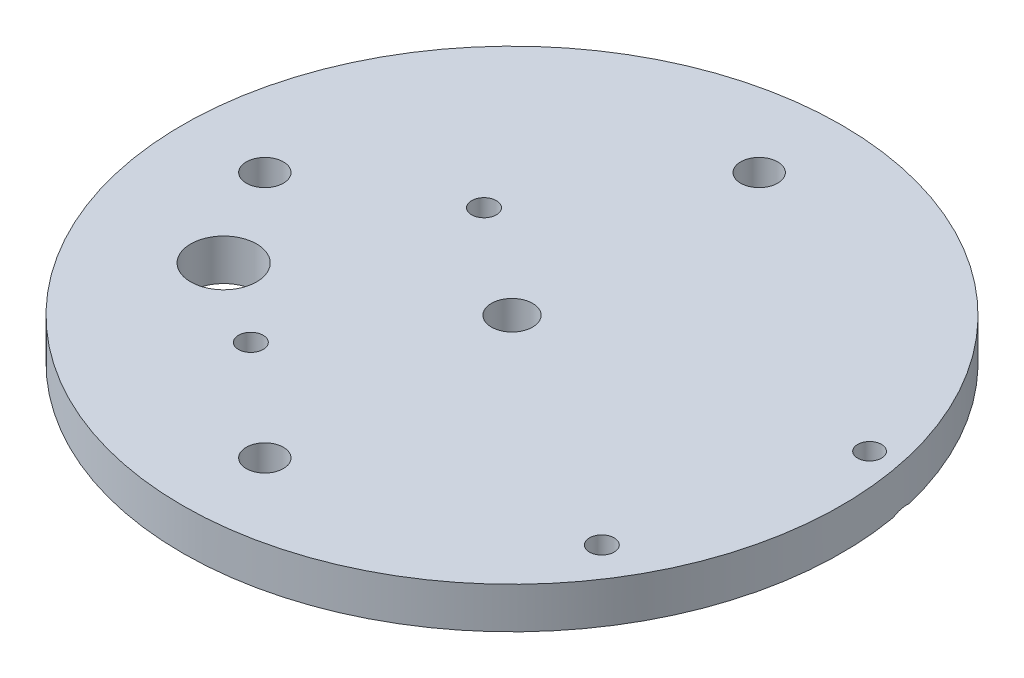
ISO-10303-21;
HEADER;
FILE_DESCRIPTION(('STEP AP214'),'2;1');
FILE_NAME('part.step','',(''),(''),'','','');
FILE_SCHEMA(('AUTOMOTIVE_DESIGN { 1 0 10303 214 1 1 1 1 }'));
ENDSEC;
DATA;
#1=APPLICATION_CONTEXT('core data for automotive mechanical design processes');
#2=APPLICATION_PROTOCOL_DEFINITION('international standard','automotive_design',2000,#1);
#3=PRODUCT_CONTEXT('',#1,'mechanical');
#4=PRODUCT('Part','Part','',(#3));
#5=PRODUCT_RELATED_PRODUCT_CATEGORY('part','',(#4));
#6=PRODUCT_DEFINITION_FORMATION('','',#4);
#7=PRODUCT_DEFINITION_CONTEXT('part definition',#1,'design');
#8=PRODUCT_DEFINITION('design','',#6,#7);
#9=PRODUCT_DEFINITION_SHAPE('','',#8);
#10=(LENGTH_UNIT() NAMED_UNIT(*) SI_UNIT(.MILLI.,.METRE.));
#11=(NAMED_UNIT(*) PLANE_ANGLE_UNIT() SI_UNIT($,.RADIAN.));
#12=(NAMED_UNIT(*) SI_UNIT($,.STERADIAN.) SOLID_ANGLE_UNIT());
#13=UNCERTAINTY_MEASURE_WITH_UNIT(LENGTH_MEASURE(1.E-05),#10,'distance_accuracy_value','');
#14=(GEOMETRIC_REPRESENTATION_CONTEXT(3) GLOBAL_UNCERTAINTY_ASSIGNED_CONTEXT((#13)) GLOBAL_UNIT_ASSIGNED_CONTEXT((#10,
#11,#12)) REPRESENTATION_CONTEXT('',''));
#15=CARTESIAN_POINT('',(0.,0.,0.));
#16=DIRECTION('',(0.,0.,1.));
#17=DIRECTION('',(1.,0.,0.));
#18=AXIS2_PLACEMENT_3D('',#15,#16,#17);
#19=CARTESIAN_POINT('',(0.,0.,0.));
#20=DIRECTION('',(0.,1.,0.));
#21=DIRECTION('',(0.,0.,1.));
#22=AXIS2_PLACEMENT_3D('',#19,#20,#21);
#23=PLANE('',#22);
#24=CARTESIAN_POINT('',(29.6,0.,18.7));
#25=DIRECTION('',(0.,1.,0.));
#26=DIRECTION('',(0.,0.,1.));
#27=AXIS2_PLACEMENT_3D('',#24,#25,#26);
#28=CIRCLE('',#27,3.49999999999999);
#29=CARTESIAN_POINT('',(29.6,0.,22.2));
#30=VERTEX_POINT('',#29);
#31=EDGE_CURVE('E70',#30,#30,#28,.T.);
#32=ORIENTED_EDGE('',*,*,#31,.T.);
#33=EDGE_LOOP('',(#32));
#34=FACE_BOUND('',#33,.T.);
#35=CARTESIAN_POINT('',(-13.,0.,18.7));
#36=DIRECTION('',(0.,1.,0.));
#37=DIRECTION('',(0.,0.,1.));
#38=AXIS2_PLACEMENT_3D('',#35,#36,#37);
#39=CIRCLE('',#38,3.49999999999999);
#40=CARTESIAN_POINT('',(-13.,0.,22.2));
#41=VERTEX_POINT('',#40);
#42=EDGE_CURVE('E157',#41,#41,#39,.T.);
#43=ORIENTED_EDGE('',*,*,#42,.T.);
#44=EDGE_LOOP('',(#43));
#45=FACE_BOUND('',#44,.T.);
#46=CARTESIAN_POINT('',(-13.,0.,-9.6));
#47=DIRECTION('',(0.,1.,0.));
#48=DIRECTION('',(0.,0.,1.));
#49=AXIS2_PLACEMENT_3D('',#46,#47,#48);
#50=CIRCLE('',#49,3.49999999999999);
#51=CARTESIAN_POINT('',(-13.,0.,-6.10000000000001));
#52=VERTEX_POINT('',#51);
#53=EDGE_CURVE('E92',#52,#52,#50,.T.);
#54=ORIENTED_EDGE('',*,*,#53,.T.);
#55=EDGE_LOOP('',(#54));
#56=FACE_BOUND('',#55,.T.);
#57=CARTESIAN_POINT('',(-23.,0.,12.));
#58=DIRECTION('',(0.,1.,0.));
#59=DIRECTION('',(0.,0.,1.));
#60=AXIS2_PLACEMENT_3D('',#57,#58,#59);
#61=CIRCLE('',#60,4.);
#62=CARTESIAN_POINT('',(-23.,0.,16.));
#63=VERTEX_POINT('',#62);
#64=EDGE_CURVE('E242',#63,#63,#61,.T.);
#65=ORIENTED_EDGE('',*,*,#64,.T.);
#66=EDGE_LOOP('',(#65));
#67=FACE_BOUND('',#66,.T.);
#68=CARTESIAN_POINT('',(-30.,0.,0.));
#69=DIRECTION('',(0.,1.,0.));
#70=DIRECTION('',(0.,0.,1.));
#71=AXIS2_PLACEMENT_3D('',#68,#69,#70);
#72=CIRCLE('',#71,2.25);
#73=CARTESIAN_POINT('',(-30.,0.,2.25));
#74=VERTEX_POINT('',#73);
#75=EDGE_CURVE('E185',#74,#74,#72,.T.);
#76=ORIENTED_EDGE('',*,*,#75,.T.);
#77=EDGE_LOOP('',(#76));
#78=FACE_BOUND('',#77,.T.);
#79=CARTESIAN_POINT('',(0.,0.,30.));
#80=DIRECTION('',(0.,1.,0.));
#81=DIRECTION('',(0.,0.,1.));
#82=AXIS2_PLACEMENT_3D('',#79,#80,#81);
#83=CIRCLE('',#82,2.25);
#84=CARTESIAN_POINT('',(0.,0.,32.25));
#85=VERTEX_POINT('',#84);
#86=EDGE_CURVE('E197',#85,#85,#83,.T.);
#87=ORIENTED_EDGE('',*,*,#86,.T.);
#88=EDGE_LOOP('',(#87));
#89=FACE_BOUND('',#88,.T.);
#90=CARTESIAN_POINT('',(0.,0.,-30.));
#91=DIRECTION('',(0.,1.,0.));
#92=DIRECTION('',(0.,0.,1.));
#93=AXIS2_PLACEMENT_3D('',#90,#91,#92);
#94=CIRCLE('',#93,2.25);
#95=CARTESIAN_POINT('',(0.,0.,-27.75));
#96=VERTEX_POINT('',#95);
#97=EDGE_CURVE('E115',#96,#96,#94,.T.);
#98=ORIENTED_EDGE('',*,*,#97,.T.);
#99=EDGE_LOOP('',(#98));
#100=FACE_BOUND('',#99,.T.);
#101=CARTESIAN_POINT('',(0.,0.,0.));
#102=DIRECTION('',(0.,1.,0.));
#103=DIRECTION('',(0.,0.,1.));
#104=AXIS2_PLACEMENT_3D('',#101,#102,#103);
#105=CIRCLE('',#104,40.);
#106=CARTESIAN_POINT('',(38.9170573557783,0.,-9.24460095228898));
#107=VERTEX_POINT('',#106);
#108=CARTESIAN_POINT('',(39.4081344277783,0.,-6.85557735877543));
#109=VERTEX_POINT('',#108);
#110=EDGE_CURVE('E69',#107,#109,#105,.T.);
#111=ORIENTED_EDGE('',*,*,#110,.F.);
#112=CARTESIAN_POINT('',(36.,0.,-7.4));
#113=DIRECTION('',(0.,1.,0.));
#114=DIRECTION('',(0.,0.,1.));
#115=AXIS2_PLACEMENT_3D('',#112,#113,#114);
#116=CIRCLE('',#115,3.45134412802979);
#117=EDGE_CURVE('E64',#107,#109,#116,.T.);
#118=ORIENTED_EDGE('',*,*,#117,.T.);
#119=EDGE_LOOP('',(#111,#118));
#120=FACE_BOUND('',#119,.T.);
#121=CARTESIAN_POINT('',(0.,0.,0.));
#122=DIRECTION('',(0.,1.,0.));
#123=DIRECTION('',(0.,0.,1.));
#124=AXIS2_PLACEMENT_3D('',#121,#122,#123);
#125=CIRCLE('',#124,8.);
#126=CARTESIAN_POINT('',(0.,0.,8.));
#127=VERTEX_POINT('',#126);
#128=EDGE_CURVE('E77',#127,#127,#125,.F.);
#129=ORIENTED_EDGE('',*,*,#128,.F.);
#130=EDGE_LOOP('',(#129));
#131=FACE_BOUND('',#130,.T.);
#132=ADVANCED_FACE('F44',(#34,#45,#56,#67,#78,#89,#100,#120,#131),#23,.F.);
#133=CARTESIAN_POINT('',(0.,5.,0.));
#134=DIRECTION('',(0.,1.,0.));
#135=DIRECTION('',(0.,0.,1.));
#136=AXIS2_PLACEMENT_3D('',#133,#134,#135);
#137=PLANE('',#136);
#138=CARTESIAN_POINT('',(-23.,5.,12.));
#139=DIRECTION('',(0.,1.,0.));
#140=DIRECTION('',(0.,0.,1.));
#141=AXIS2_PLACEMENT_3D('',#138,#139,#140);
#142=CIRCLE('',#141,4.);
#143=CARTESIAN_POINT('',(-23.,5.,16.));
#144=VERTEX_POINT('',#143);
#145=EDGE_CURVE('E239',#144,#144,#142,.T.);
#146=ORIENTED_EDGE('',*,*,#145,.F.);
#147=EDGE_LOOP('',(#146));
#148=FACE_BOUND('',#147,.T.);
#149=CARTESIAN_POINT('',(-13.,5.,18.7));
#150=DIRECTION('',(0.,1.,0.));
#151=DIRECTION('',(0.,0.,1.));
#152=AXIS2_PLACEMENT_3D('',#149,#150,#151);
#153=CIRCLE('',#152,1.5);
#154=CARTESIAN_POINT('',(-13.,5.,20.2));
#155=VERTEX_POINT('',#154);
#156=EDGE_CURVE('E243',#155,#155,#153,.T.);
#157=ORIENTED_EDGE('',*,*,#156,.F.);
#158=EDGE_LOOP('',(#157));
#159=FACE_BOUND('',#158,.T.);
#160=CARTESIAN_POINT('',(29.6,5.,18.7));
#161=DIRECTION('',(0.,1.,0.));
#162=DIRECTION('',(0.,0.,1.));
#163=AXIS2_PLACEMENT_3D('',#160,#161,#162);
#164=CIRCLE('',#163,1.5);
#165=CARTESIAN_POINT('',(29.6,5.,20.2));
#166=VERTEX_POINT('',#165);
#167=EDGE_CURVE('E188',#166,#166,#164,.T.);
#168=ORIENTED_EDGE('',*,*,#167,.F.);
#169=EDGE_LOOP('',(#168));
#170=FACE_BOUND('',#169,.T.);
#171=CARTESIAN_POINT('',(36.,5.,-7.4));
#172=DIRECTION('',(0.,1.,0.));
#173=DIRECTION('',(0.,0.,1.));
#174=AXIS2_PLACEMENT_3D('',#171,#172,#173);
#175=CIRCLE('',#174,1.4513441280298);
#176=CARTESIAN_POINT('',(36.,5.,-5.9486558719702));
#177=VERTEX_POINT('',#176);
#178=EDGE_CURVE('E182',#177,#177,#175,.T.);
#179=ORIENTED_EDGE('',*,*,#178,.F.);
#180=EDGE_LOOP('',(#179));
#181=FACE_BOUND('',#180,.T.);
#182=CARTESIAN_POINT('',(-13.,5.,-9.6));
#183=DIRECTION('',(0.,1.,0.));
#184=DIRECTION('',(0.,0.,1.));
#185=AXIS2_PLACEMENT_3D('',#182,#183,#184);
#186=CIRCLE('',#185,1.5);
#187=CARTESIAN_POINT('',(-13.,5.,-8.1));
#188=VERTEX_POINT('',#187);
#189=EDGE_CURVE('E179',#188,#188,#186,.T.);
#190=ORIENTED_EDGE('',*,*,#189,.F.);
#191=EDGE_LOOP('',(#190));
#192=FACE_BOUND('',#191,.T.);
#193=CARTESIAN_POINT('',(-30.,5.,0.));
#194=DIRECTION('',(0.,1.,0.));
#195=DIRECTION('',(0.,0.,1.));
#196=AXIS2_PLACEMENT_3D('',#193,#194,#195);
#197=CIRCLE('',#196,2.25);
#198=CARTESIAN_POINT('',(-30.,5.,2.25));
#199=VERTEX_POINT('',#198);
#200=EDGE_CURVE('E181',#199,#199,#197,.T.);
#201=ORIENTED_EDGE('',*,*,#200,.F.);
#202=EDGE_LOOP('',(#201));
#203=FACE_BOUND('',#202,.T.);
#204=CARTESIAN_POINT('',(0.,5.,30.));
#205=DIRECTION('',(0.,1.,0.));
#206=DIRECTION('',(0.,0.,1.));
#207=AXIS2_PLACEMENT_3D('',#204,#205,#206);
#208=CIRCLE('',#207,2.25);
#209=CARTESIAN_POINT('',(0.,5.,32.25));
#210=VERTEX_POINT('',#209);
#211=EDGE_CURVE('E194',#210,#210,#208,.T.);
#212=ORIENTED_EDGE('',*,*,#211,.F.);
#213=EDGE_LOOP('',(#212));
#214=FACE_BOUND('',#213,.T.);
#215=CARTESIAN_POINT('',(0.,5.,-30.));
#216=DIRECTION('',(0.,1.,0.));
#217=DIRECTION('',(0.,0.,1.));
#218=AXIS2_PLACEMENT_3D('',#215,#216,#217);
#219=CIRCLE('',#218,2.25);
#220=CARTESIAN_POINT('',(0.,5.,-27.75));
#221=VERTEX_POINT('',#220);
#222=EDGE_CURVE('E199',#221,#221,#219,.T.);
#223=ORIENTED_EDGE('',*,*,#222,.F.);
#224=EDGE_LOOP('',(#223));
#225=FACE_BOUND('',#224,.T.);
#226=CARTESIAN_POINT('',(0.,5.,0.));
#227=DIRECTION('',(0.,1.,0.));
#228=DIRECTION('',(0.,0.,1.));
#229=AXIS2_PLACEMENT_3D('',#226,#227,#228);
#230=CIRCLE('',#229,40.);
#231=CARTESIAN_POINT('',(0.,5.,40.));
#232=VERTEX_POINT('',#231);
#233=EDGE_CURVE('E73',#232,#232,#230,.T.);
#234=ORIENTED_EDGE('',*,*,#233,.T.);
#235=EDGE_LOOP('',(#234));
#236=FACE_BOUND('',#235,.T.);
#237=CARTESIAN_POINT('',(0.,5.,0.));
#238=DIRECTION('',(0.,1.,0.));
#239=DIRECTION('',(0.,0.,1.));
#240=AXIS2_PLACEMENT_3D('',#237,#238,#239);
#241=CIRCLE('',#240,2.5);
#242=CARTESIAN_POINT('',(0.,5.,2.5));
#243=VERTEX_POINT('',#242);
#244=EDGE_CURVE('E74',#243,#243,#241,.T.);
#245=ORIENTED_EDGE('',*,*,#244,.F.);
#246=EDGE_LOOP('',(#245));
#247=FACE_BOUND('',#246,.T.);
#248=ADVANCED_FACE('F123',(#148,#159,#170,#181,#192,#203,#214,#225,#236,#247),#137,.T.);
#249=CARTESIAN_POINT('',(0.,5.,0.));
#250=DIRECTION('',(0.,-1.,0.));
#251=DIRECTION('',(0.,0.,-1.));
#252=AXIS2_PLACEMENT_3D('',#249,#250,#251);
#253=CYLINDRICAL_SURFACE('',#252,40.);
#254=ORIENTED_EDGE('',*,*,#233,.F.);
#255=EDGE_LOOP('',(#254));
#256=FACE_BOUND('',#255,.T.);
#257=ORIENTED_EDGE('',*,*,#110,.T.);
#258=CARTESIAN_POINT('',(39.4081344277783,0.,-6.85557735877543));
#259=CARTESIAN_POINT('',(39.389376291295,0.0355863271321334,-6.9634231640229));
#260=CARTESIAN_POINT('',(39.3699343817354,0.0672935725469322,-7.07254259796736));
#261=CARTESIAN_POINT('',(39.3297002429093,0.121685046320437,-7.2929546006696));
#262=CARTESIAN_POINT('',(39.3089057290956,0.144353522396825,-7.40425061171592));
#263=CARTESIAN_POINT('',(39.2666813407271,0.178754827413858,-7.62495853282954));
#264=CARTESIAN_POINT('',(39.2452883179097,0.190790593423214,-7.73432913791997));
#265=CARTESIAN_POINT('',(39.2014740562354,0.204298750756867,-7.95342000104407));
#266=CARTESIAN_POINT('',(39.1790538386361,0.205781414268566,-8.06313981503189));
#267=CARTESIAN_POINT('',(39.1373837745904,0.198794159584894,-8.26278986852109));
#268=CARTESIAN_POINT('',(39.1182683673851,0.192025837137742,-8.35281262088986));
#269=CARTESIAN_POINT('',(39.0795739445826,0.171567512592041,-8.53201659810573));
#270=CARTESIAN_POINT('',(39.0599946773213,0.157873667148732,-8.62119732764508));
#271=CARTESIAN_POINT('',(39.0199995528053,0.12367673181168,-8.80047039302684));
#272=CARTESIAN_POINT('',(38.9995750379144,0.103011122410356,-8.89052928858857));
#273=CARTESIAN_POINT('',(38.9584826384009,0.0557561737508828,-9.06890397923994));
#274=CARTESIAN_POINT('',(38.937815090017,0.0291742737431636,-9.15722181307193));
#275=CARTESIAN_POINT('',(38.9170573557783,0.,-9.24460095228898));
#276=B_SPLINE_CURVE_WITH_KNOTS('',3,(#258,#259,#260,#261,#262,#263,#264,#265,#266,#267,#268,
#269,#270,#271,#272,#273,#274,#275),.UNSPECIFIED.,.F.,.F.,(4,2,2,2,2,2,2,2,4),(0.,
0.34539998016559,0.691399301219693,1.02718938133422,1.36265256507567,1.63922118707444,
1.9159434605542,2.19962207449496,2.48294598106767),.UNSPECIFIED.);
#277=EDGE_CURVE('E58',#109,#107,#276,.T.);
#278=ORIENTED_EDGE('',*,*,#277,.T.);
#279=EDGE_LOOP('',(#257,#278));
#280=FACE_BOUND('',#279,.T.);
#281=ADVANCED_FACE('F72',(#256,#280),#253,.T.);
#282=CARTESIAN_POINT('',(0.,5.,0.));
#283=DIRECTION('',(0.,-1.,0.));
#284=DIRECTION('',(0.,0.,-1.));
#285=AXIS2_PLACEMENT_3D('',#282,#283,#284);
#286=CYLINDRICAL_SURFACE('',#285,2.5);
#287=CARTESIAN_POINT('',(1.8781639970993,-5.,-1.64999999999999));
#288=CARTESIAN_POINT('',(1.87817356740867,-5.08079427655975,-1.64999443072165));
#289=CARTESIAN_POINT('',(1.88347418282793,-5.16162636905579,-1.64401449371115));
#290=CARTESIAN_POINT('',(1.90365752241833,-5.32041795060532,-1.62058860250622));
#291=CARTESIAN_POINT('',(1.91855745048961,-5.39837201591593,-1.60312206083478));
#292=CARTESIAN_POINT('',(1.95530612756549,-5.54863333158224,-1.55807727538569));
#293=CARTESIAN_POINT('',(1.97708883218857,-5.62098643150526,-1.53059477126483));
#294=CARTESIAN_POINT('',(2.02503214275445,-5.75994524738077,-1.46657517741325));
#295=CARTESIAN_POINT('',(2.05119370638085,-5.82654970122849,-1.43003610611275));
#296=CARTESIAN_POINT('',(2.10971828562919,-5.96321736687682,-1.34248359301899));
#297=CARTESIAN_POINT('',(2.14241946389368,-6.03226727651007,-1.29011420470094));
#298=CARTESIAN_POINT('',(2.20758221587982,-6.16147714614391,-1.17514144468481));
#299=CARTESIAN_POINT('',(2.24004353252863,-6.22162860029669,-1.11252840012498));
#300=CARTESIAN_POINT('',(2.3064419767716,-6.33973271619889,-0.968234915676887));
#301=CARTESIAN_POINT('',(2.33994640603817,-6.39619090363768,-0.885111648041911));
#302=CARTESIAN_POINT('',(2.39949293751456,-6.49384115428655,-0.707908997031467));
#303=CARTESIAN_POINT('',(2.42554320107045,-6.53504992824281,-0.613841755901933));
#304=CARTESIAN_POINT('',(2.46464353514927,-6.59607361226671,-0.428365536633279));
#305=CARTESIAN_POINT('',(2.47881191391302,-6.61774914948943,-0.337811072451684));
#306=CARTESIAN_POINT('',(2.49700266516609,-6.64549014711654,-0.153380704926458));
#307=CARTESIAN_POINT('',(2.50103745363967,-6.65157471024374,-0.059509009173567));
#308=CARTESIAN_POINT('',(2.49868729659539,-6.64800862462095,0.113712663637904));
#309=CARTESIAN_POINT('',(2.49376656842582,-6.64056933208684,0.193140500290941));
#310=CARTESIAN_POINT('',(2.47671798966374,-6.61453692457821,0.349338308191109));
#311=CARTESIAN_POINT('',(2.46458960851095,-6.5959429885018,0.426108083336222));
#312=CARTESIAN_POINT('',(2.4341916732427,-6.54858528412733,0.574862419576155));
#313=CARTESIAN_POINT('',(2.41593946394568,-6.51985022722838,0.646859815580455));
#314=CARTESIAN_POINT('',(2.37464804586783,-6.45331789592822,0.785017034503288));
#315=CARTESIAN_POINT('',(2.35160793342517,-6.41551891060689,0.851175752075159));
#316=CARTESIAN_POINT('',(2.29902245001356,-6.32644819163509,0.985047000791311));
#317=CARTESIAN_POINT('',(2.26902056419845,-6.27406230137877,1.05183695764556));
#318=CARTESIAN_POINT('',(2.20709218917539,-6.16019022775838,1.17625968695308));
#319=CARTESIAN_POINT('',(2.17516278943164,-6.09869006733422,1.23387810796581));
#320=CARTESIAN_POINT('',(2.10711048312635,-5.95750690257424,1.34724934289721));
#321=CARTESIAN_POINT('',(2.07108428413495,-5.87648069757491,1.40139996434747));
#322=CARTESIAN_POINT('',(2.00437957659369,-5.70447022283533,1.49525229324493));
#323=CARTESIAN_POINT('',(1.973691925336,-5.61350342114149,1.53497883258691));
#324=CARTESIAN_POINT('',(1.93021206234819,-5.45004901179961,1.58906609884217));
#325=CARTESIAN_POINT('',(1.91481376393407,-5.37958306194072,1.60742065844977));
#326=CARTESIAN_POINT('',(1.89156962487726,-5.23568483824098,1.63471528383588));
#327=CARTESIAN_POINT('',(1.88371114115,-5.16225774603093,1.64367111218457));
#328=CARTESIAN_POINT('',(1.8767563549997,-5.01413898103529,1.65161100823904));
#329=CARTESIAN_POINT('',(1.87769482426888,-4.93944345582033,1.65055550398266));
#330=CARTESIAN_POINT('',(1.88825914723377,-4.79146670785288,1.6384550878589));
#331=CARTESIAN_POINT('',(1.89789215655036,-4.71818670082213,1.62740194790476));
#332=CARTESIAN_POINT('',(1.92377320788271,-4.57815606994752,1.59670654181037));
#333=CARTESIAN_POINT('',(1.9397182942886,-4.5112601566981,1.57745493961547));
#334=CARTESIAN_POINT('',(1.97637475195715,-4.38158821030647,1.53127715983157));
#335=CARTESIAN_POINT('',(1.99708770330354,-4.31881355184297,1.50434843731629));
#336=CARTESIAN_POINT('',(2.04592024038531,-4.18584653371123,1.43744371796295));
#337=CARTESIAN_POINT('',(2.0746933834994,-4.11666627761783,1.3959374151933));
#338=CARTESIAN_POINT('',(2.13386307226145,-3.9854540035836,1.30370192953132));
#339=CARTESIAN_POINT('',(2.16426156090022,-3.92343083426984,1.2529615255776));
#340=CARTESIAN_POINT('',(2.23066104299162,-3.79502279309446,1.13132559349666));
#341=CARTESIAN_POINT('',(2.26650752858329,-3.73042825569478,1.0584336843705));
#342=CARTESIAN_POINT('',(2.33354741548986,-3.61429294484175,0.901029136145233));
#343=CARTESIAN_POINT('',(2.36474520160667,-3.56273983785047,0.816527594120797));
#344=CARTESIAN_POINT('',(2.41383928477658,-3.48346296196824,0.655022436944608));
#345=CARTESIAN_POINT('',(2.43314294605933,-3.45305320616478,0.579766982761488));
#346=CARTESIAN_POINT('',(2.46500344203446,-3.40340770004291,0.42430571779809));
#347=CARTESIAN_POINT('',(2.47756592552063,-3.38416259316718,0.344104114697708));
#348=CARTESIAN_POINT('',(2.49483359194805,-3.35780779187866,0.180532057501467));
#349=CARTESIAN_POINT('',(2.49950622522129,-3.35074836698326,0.0971499203467993));
#350=CARTESIAN_POINT('',(2.50041880991432,-3.34936521725825,-0.0697703046886462));
#351=CARTESIAN_POINT('',(2.49665914509096,-3.35504091284884,-0.153308385299503));
#352=CARTESIAN_POINT('',(2.48162224491363,-3.37795948175331,-0.312248842068666));
#353=CARTESIAN_POINT('',(2.47086791156197,-3.39439826797345,-0.387820405838236));
#354=CARTESIAN_POINT('',(2.44325497490618,-3.43722616352497,-0.534890956581199));
#355=CARTESIAN_POINT('',(2.4263954123254,-3.46361683656132,-0.606389301510788));
#356=CARTESIAN_POINT('',(2.38659098522815,-3.52725696718865,-0.748299731069997));
#357=CARTESIAN_POINT('',(2.36333062488106,-3.56508395318079,-0.818362050887256));
#358=CARTESIAN_POINT('',(2.31298664760704,-3.64960758414194,-0.951399734920279));
#359=CARTESIAN_POINT('',(2.2859005630314,-3.69630996063965,-1.01437047747239));
#360=CARTESIAN_POINT('',(2.2252813274897,-3.80552907515259,-1.14186276834818));
#361=CARTESIAN_POINT('',(2.19140310364951,-3.86937720174746,-1.20508031729177));
#362=CARTESIAN_POINT('',(2.12387294022856,-4.00656834044153,-1.32046767601712));
#363=CARTESIAN_POINT('',(2.09022116132146,-4.07991747200145,-1.37263030790415));
#364=CARTESIAN_POINT('',(2.02963185186414,-4.22797320198263,-1.46053735742482));
#365=CARTESIAN_POINT('',(2.00236030827309,-4.30189495776458,-1.49736813204505));
#366=CARTESIAN_POINT('',(1.95397052678842,-4.4561091328833,-1.55999123252304));
#367=CARTESIAN_POINT('',(1.93283919103844,-4.53638751989309,-1.58580711054236));
#368=CARTESIAN_POINT('',(1.90415675714692,-4.6806913968137,-1.62004735146956));
#369=CARTESIAN_POINT('',(1.89451740482452,-4.74364690760695,-1.63122690692697));
#370=CARTESIAN_POINT('',(1.88151889606353,-4.87106080182247,-1.64620346660994));
#371=CARTESIAN_POINT('',(1.87815635906731,-4.93551835732424,-1.65000444482245));
#372=CARTESIAN_POINT('',(1.8781639970993,-5.,-1.64999999999999));
#373=B_SPLINE_CURVE_WITH_KNOTS('',3,(#287,#288,#289,#290,#291,#292,#293,#294,#295,#296,#297,
#298,#299,#300,#301,#302,#303,#304,#305,#306,#307,#308,#309,#310,#311,#312,#313,#314,#315,#316,
#317,#318,#319,#320,#321,#322,#323,#324,#325,#326,#327,#328,#329,#330,#331,#332,#333,#334,#335,
#336,#337,#338,#339,#340,#341,#342,#343,#344,#345,#346,#347,#348,#349,#350,#351,#352,#353,#354,
#355,#356,#357,#358,#359,#360,#361,#362,#363,#364,#365,#366,#367,#368,#369,#370,#371,#372),
.UNSPECIFIED.,.T.,.F.,(4,2,2,2,2,2,2,2,2,2,2,2,2,2,2,2,2,2,2,2,2,2,2,2,2,2,2,2,2,2,2,2,2,2,2,2,
2,2,2,2,2,2,4),(0.,0.242089089232209,0.484613262365224,0.724877542229116,0.965194438206264,
1.24204242334406,1.5191533550871,1.83517136959404,2.1508420497088,2.43163690958525,
2.71208756281941,2.95071293244789,3.18935586962916,3.42732851395788,3.66534611375402,
3.93440451568682,4.20387988176698,4.51414003592553,4.82386349786488,5.04625677123857,
5.26827647088752,5.4911741161079,5.714255373899,5.92772322794782,6.14126192794923,
6.3973226153228,6.65369656488881,6.96356575078108,7.27314078239634,7.52238413686407,
7.77141830954319,8.02147738775783,8.2715250859267,8.50474641601314,8.73800440662632,
8.98590102363142,9.23395827408606,9.52089661145359,9.80802068929718,10.067982581361,
10.327385800336,10.5207004402689,10.713910935025),.UNSPECIFIED.);
#374=CARTESIAN_POINT('',(1.8781639970993,-5.,-1.64999999999999));
#375=VERTEX_POINT('',#374);
#376=EDGE_CURVE('E108',#375,#375,#373,.T.);
#377=ORIENTED_EDGE('',*,*,#376,.F.);
#378=EDGE_LOOP('',(#377));
#379=FACE_BOUND('',#378,.T.);
#380=ORIENTED_EDGE('',*,*,#244,.T.);
#381=EDGE_LOOP('',(#380));
#382=FACE_BOUND('',#381,.T.);
#383=CARTESIAN_POINT('',(0.,-10.,0.));
#384=DIRECTION('',(0.,-1.,0.));
#385=DIRECTION('',(0.,0.,-1.));
#386=AXIS2_PLACEMENT_3D('',#383,#384,#385);
#387=CIRCLE('',#386,2.5);
#388=CARTESIAN_POINT('',(0.,-10.,-2.5));
#389=VERTEX_POINT('',#388);
#390=EDGE_CURVE('E114',#389,#389,#387,.T.);
#391=ORIENTED_EDGE('',*,*,#390,.T.);
#392=EDGE_LOOP('',(#391));
#393=FACE_BOUND('',#392,.T.);
#394=ADVANCED_FACE('F118',(#379,#382,#393),#286,.F.);
#395=CARTESIAN_POINT('',(0.,-10.,0.));
#396=DIRECTION('',(0.,-1.,0.));
#397=DIRECTION('',(0.,0.,-1.));
#398=AXIS2_PLACEMENT_3D('',#395,#396,#397);
#399=PLANE('',#398);
#400=CARTESIAN_POINT('',(0.,-10.,0.));
#401=DIRECTION('',(0.,-1.,0.));
#402=DIRECTION('',(0.,0.,-1.));
#403=AXIS2_PLACEMENT_3D('',#400,#401,#402);
#404=CIRCLE('',#403,8.);
#405=CARTESIAN_POINT('',(0.,-10.,-8.));
#406=VERTEX_POINT('',#405);
#407=EDGE_CURVE('E80',#406,#406,#404,.T.);
#408=ORIENTED_EDGE('',*,*,#407,.T.);
#409=EDGE_LOOP('',(#408));
#410=FACE_BOUND('',#409,.T.);
#411=ORIENTED_EDGE('',*,*,#390,.F.);
#412=EDGE_LOOP('',(#411));
#413=FACE_BOUND('',#412,.T.);
#414=ADVANCED_FACE('F105',(#410,#413),#399,.T.);
#415=CARTESIAN_POINT('',(0.,-10.,0.));
#416=DIRECTION('',(0.,1.,0.));
#417=DIRECTION('',(0.,0.,1.));
#418=AXIS2_PLACEMENT_3D('',#415,#416,#417);
#419=CYLINDRICAL_SURFACE('',#418,8.);
#420=CARTESIAN_POINT('',(7.82799463464303,-5.,-1.64999999999999));
#421=CARTESIAN_POINT('',(7.82799647234762,-5.09161734979413,-1.64999668532492));
#422=CARTESIAN_POINT('',(7.82962054015776,-5.18327581475285,-1.64234339972763));
#423=CARTESIAN_POINT('',(7.83593102109728,-5.36399536908582,-1.61196056082935));
#424=CARTESIAN_POINT('',(7.84061980768031,-5.45305438944651,-1.58921932254547));
#425=CARTESIAN_POINT('',(7.85250661788931,-5.62593449220463,-1.52939944297713));
#426=CARTESIAN_POINT('',(7.85970206178508,-5.70976085561277,-1.49233553761891));
#427=CARTESIAN_POINT('',(7.8757883628587,-5.87000460226487,-1.40496339378156));
#428=CARTESIAN_POINT('',(7.88467914491256,-5.94642231357555,-1.35465574212316));
#429=CARTESIAN_POINT('',(7.90330366333985,-6.09083130314561,-1.24141806188275));
#430=CARTESIAN_POINT('',(7.91304715328143,-6.15869500128047,-1.17832691131058));
#431=CARTESIAN_POINT('',(7.93219354684102,-6.28295461376031,-1.04166118718968));
#432=CARTESIAN_POINT('',(7.9415964257225,-6.33934969657567,-0.968085854144698));
#433=CARTESIAN_POINT('',(7.95910768239297,-6.43956942635826,-0.811692001393452));
#434=CARTESIAN_POINT('',(7.9672032148807,-6.48327235381807,-0.728793920101061));
#435=CARTESIAN_POINT('',(7.98107786735649,-6.55608110943422,-0.556636173632876));
#436=CARTESIAN_POINT('',(7.9868572180665,-6.58518839158007,-0.467377143134514));
#437=CARTESIAN_POINT('',(7.99537941797959,-6.62758111250496,-0.286356118265318));
#438=CARTESIAN_POINT('',(7.99816360714569,-6.64108215209674,-0.194646593521387));
#439=CARTESIAN_POINT('',(8.00052470522147,-6.65255227142172,-0.0102247919218247));
#440=CARTESIAN_POINT('',(8.00010194196704,-6.65052293877214,0.0824873814688693));
#441=CARTESIAN_POINT('',(7.9961286601365,-6.63115248809589,0.264799667160885));
#442=CARTESIAN_POINT('',(7.99262559257093,-6.61404365512092,0.354425644609061));
#443=CARTESIAN_POINT('',(7.98293899531616,-6.56536885357579,0.529506535845924));
#444=CARTESIAN_POINT('',(7.97675535366161,-6.53380228111471,0.61496127523955));
#445=CARTESIAN_POINT('',(7.96232481023259,-6.45689604030913,0.779930808135332));
#446=CARTESIAN_POINT('',(7.95406448397429,-6.41146633010899,0.859402403191198));
#447=CARTESIAN_POINT('',(7.93638961806161,-6.30819018594216,1.00967984091354));
#448=CARTESIAN_POINT('',(7.92697493766869,-6.25034223730045,1.08048462481769));
#449=CARTESIAN_POINT('',(7.9078239642189,-6.12260050730486,1.21279807501824));
#450=CARTESIAN_POINT('',(7.89808494418976,-6.05250342398988,1.27411022634264));
#451=CARTESIAN_POINT('',(7.87954771497238,-5.90292295474092,1.38414252261933));
#452=CARTESIAN_POINT('',(7.87074952591437,-5.82343936804768,1.43286239817597));
#453=CARTESIAN_POINT('',(7.85508413098618,-5.65704845467704,1.51640121308693));
#454=CARTESIAN_POINT('',(7.84822159457677,-5.57012382444694,1.55118662114807));
#455=CARTESIAN_POINT('',(7.83727167258975,-5.39148889177412,1.60559987539903));
#456=CARTESIAN_POINT('',(7.83318390018328,-5.29977925832742,1.62522983445702));
#457=CARTESIAN_POINT('',(7.82832430034405,-5.11596343547278,1.64847767759946));
#458=CARTESIAN_POINT('',(7.82749355348184,-5.02389475085064,1.65238010858405));
#459=CARTESIAN_POINT('',(7.82908365669821,-4.840422126306,1.64482933127385));
#460=CARTESIAN_POINT('',(7.83150430988348,-4.74901814646834,1.63337705280604));
#461=CARTESIAN_POINT('',(7.83926913983493,-4.57043707429369,1.59568777426685));
#462=CARTESIAN_POINT('',(7.84458293687797,-4.48322613369048,1.56960432546508));
#463=CARTESIAN_POINT('',(7.85750843647708,-4.31441223673719,1.50355797289372));
#464=CARTESIAN_POINT('',(7.86512033846231,-4.23280976784409,1.46359386451765));
#465=CARTESIAN_POINT('',(7.88191579950281,-4.07628854815773,1.37028211396985));
#466=CARTESIAN_POINT('',(7.89111960565472,-4.00147762450433,1.31675731908658));
#467=CARTESIAN_POINT('',(7.91000699478186,-3.86179547619869,1.19807829347332));
#468=CARTESIAN_POINT('',(7.91969063034348,-3.79692534419906,1.1329227860428));
#469=CARTESIAN_POINT('',(7.93863877717957,-3.67787906230575,0.991551131023625));
#470=CARTESIAN_POINT('',(7.94789380519354,-3.62389583014193,0.915171051258584));
#471=CARTESIAN_POINT('',(7.96477402593325,-3.52952771722255,0.754260738130263));
#472=CARTESIAN_POINT('',(7.97239928979603,-3.48914224289872,0.669730860728576));
#473=CARTESIAN_POINT('',(7.98512048804082,-3.42339319408157,0.495414150876531));
#474=CARTESIAN_POINT('',(7.99023131933467,-3.39794096923201,0.405661891513267));
#475=CARTESIAN_POINT('',(7.99741186635557,-3.36250124752192,0.223039444294583));
#476=CARTESIAN_POINT('',(7.99948197278732,-3.35251176383492,0.130169658580919));
#477=CARTESIAN_POINT('',(8.00033781964049,-3.34836207224363,-0.0542126492055755));
#478=CARTESIAN_POINT('',(7.99918360281958,-3.35391248751723,-0.145718502140299));
#479=CARTESIAN_POINT('',(7.99384751004402,-3.38004339509045,-0.326463478938167));
#480=CARTESIAN_POINT('',(7.98966567723011,-3.40062367322843,-0.415702635080896));
#481=CARTESIAN_POINT('',(7.97874682116246,-3.4560981411582,-0.589186560182794));
#482=CARTESIAN_POINT('',(7.97201637401338,-3.49095551098701,-0.673443542985804));
#483=CARTESIAN_POINT('',(7.95672300876336,-3.57395704210639,-0.834953513276948));
#484=CARTESIAN_POINT('',(7.9481599348062,-3.62210233357253,-0.912205904261775));
#485=CARTESIAN_POINT('',(7.92995681960445,-3.73127864528562,-1.05893847166513));
#486=CARTESIAN_POINT('',(7.92030089151862,-3.79251556975004,-1.12826349060998));
#487=CARTESIAN_POINT('',(7.90109178015231,-3.92571624164647,-1.25575285452552));
#488=CARTESIAN_POINT('',(7.89153862187157,-3.99768253854538,-1.31391453937943));
#489=CARTESIAN_POINT('',(7.8734942340194,-4.15130110382791,-1.41807001635073));
#490=CARTESIAN_POINT('',(7.86501660134749,-4.23305600230841,-1.46391490783103));
#491=CARTESIAN_POINT('',(7.85025069483304,-4.40326288616914,-1.54114313624575));
#492=CARTESIAN_POINT('',(7.84396047891661,-4.4917088455668,-1.57253930936729));
#493=CARTESIAN_POINT('',(7.83550744278865,-4.65026722430231,-1.61404620798977));
#494=CARTESIAN_POINT('',(7.83270799535493,-4.71948894840104,-1.62750420424827));
#495=CARTESIAN_POINT('',(7.82895092043294,-4.85913237654465,-1.64548220150438));
#496=CARTESIAN_POINT('',(7.82799322160417,-4.92955403400329,-1.65000254870378));
#497=CARTESIAN_POINT('',(7.82799463464303,-5.,-1.64999999999999));
#498=B_SPLINE_CURVE_WITH_KNOTS('',3,(#420,#421,#422,#423,#424,#425,#426,#427,#428,#429,#430,
#431,#432,#433,#434,#435,#436,#437,#438,#439,#440,#441,#442,#443,#444,#445,#446,#447,#448,#449,
#450,#451,#452,#453,#454,#455,#456,#457,#458,#459,#460,#461,#462,#463,#464,#465,#466,#467,#468,
#469,#470,#471,#472,#473,#474,#475,#476,#477,#478,#479,#480,#481,#482,#483,#484,#485,#486,#487,
#488,#489,#490,#491,#492,#493,#494,#495,#496,#497),.UNSPECIFIED.,.T.,.F.,(4,2,2,2,2,2,2,2,2,2,2,
2,2,2,2,2,2,2,2,2,2,2,2,2,2,2,2,2,2,2,2,2,2,2,2,2,2,2,4),(0.,0.274594036981748,
0.549400984088784,0.823925944657619,1.09843874327275,1.3766547467594,1.65489091505464,
1.93571338943597,2.21650788327396,2.49337499570617,2.77021380533169,3.04286128513492,
3.31552015429502,3.58998907522694,3.86449149267071,4.14407920367272,4.42367289560188,
4.70393540521656,4.98415883550649,5.25928898855092,5.53440248143714,5.80668132243979,
6.07898379854716,6.35504561674316,6.63113775683408,6.91175972338563,7.19236943866018,
7.47129602001292,7.75018675877313,8.0239188465182,8.29764703391011,8.57067368982017,
8.84372357458456,9.12143378060408,9.39921008040024,9.68020708192076,9.96095396255215,
10.1721016499172,10.38324115827),.UNSPECIFIED.);
#499=CARTESIAN_POINT('',(7.82799463464303,-5.,-1.64999999999999));
#500=VERTEX_POINT('',#499);
#501=EDGE_CURVE('E85',#500,#500,#498,.T.);
#502=ORIENTED_EDGE('',*,*,#501,.T.);
#503=EDGE_LOOP('',(#502));
#504=FACE_BOUND('',#503,.T.);
#505=ORIENTED_EDGE('',*,*,#407,.F.);
#506=EDGE_LOOP('',(#505));
#507=FACE_BOUND('',#506,.T.);
#508=ORIENTED_EDGE('',*,*,#128,.T.);
#509=EDGE_LOOP('',(#508));
#510=FACE_BOUND('',#509,.T.);
#511=ADVANCED_FACE('F94',(#504,#507,#510),#419,.T.);
#512=CARTESIAN_POINT('',(8.,-5.,0.));
#513=DIRECTION('',(1.,0.,0.));
#514=DIRECTION('',(0.,0.,-1.));
#515=AXIS2_PLACEMENT_3D('',#512,#513,#514);
#516=CYLINDRICAL_SURFACE('',#515,1.64999999999999);
#517=ORIENTED_EDGE('',*,*,#376,.T.);
#518=EDGE_LOOP('',(#517));
#519=FACE_BOUND('',#518,.T.);
#520=ORIENTED_EDGE('',*,*,#501,.F.);
#521=EDGE_LOOP('',(#520));
#522=FACE_BOUND('',#521,.T.);
#523=ADVANCED_FACE('F98',(#519,#522),#516,.F.);
#524=CARTESIAN_POINT('',(0.,-10.,-30.));
#525=DIRECTION('',(0.,1.,0.));
#526=DIRECTION('',(0.,0.,1.));
#527=AXIS2_PLACEMENT_3D('',#524,#525,#526);
#528=CYLINDRICAL_SURFACE('',#527,2.25);
#529=ORIENTED_EDGE('',*,*,#222,.T.);
#530=EDGE_LOOP('',(#529));
#531=FACE_BOUND('',#530,.T.);
#532=ORIENTED_EDGE('',*,*,#97,.F.);
#533=EDGE_LOOP('',(#532));
#534=FACE_BOUND('',#533,.T.);
#535=ADVANCED_FACE('F102',(#531,#534),#528,.F.);
#536=CARTESIAN_POINT('',(0.,-10.,30.));
#537=DIRECTION('',(0.,1.,0.));
#538=DIRECTION('',(0.,0.,1.));
#539=AXIS2_PLACEMENT_3D('',#536,#537,#538);
#540=CYLINDRICAL_SURFACE('',#539,2.25);
#541=ORIENTED_EDGE('',*,*,#211,.T.);
#542=EDGE_LOOP('',(#541));
#543=FACE_BOUND('',#542,.T.);
#544=ORIENTED_EDGE('',*,*,#86,.F.);
#545=EDGE_LOOP('',(#544));
#546=FACE_BOUND('',#545,.T.);
#547=ADVANCED_FACE('F208',(#543,#546),#540,.F.);
#548=CARTESIAN_POINT('',(-30.,-10.,0.));
#549=DIRECTION('',(0.,1.,0.));
#550=DIRECTION('',(0.,0.,1.));
#551=AXIS2_PLACEMENT_3D('',#548,#549,#550);
#552=CYLINDRICAL_SURFACE('',#551,2.25);
#553=ORIENTED_EDGE('',*,*,#200,.T.);
#554=EDGE_LOOP('',(#553));
#555=FACE_BOUND('',#554,.T.);
#556=ORIENTED_EDGE('',*,*,#75,.F.);
#557=EDGE_LOOP('',(#556));
#558=FACE_BOUND('',#557,.T.);
#559=ADVANCED_FACE('F175',(#555,#558),#552,.F.);
#560=CARTESIAN_POINT('',(-13.,-10.,-9.6));
#561=DIRECTION('',(0.,1.,0.));
#562=DIRECTION('',(0.,0.,1.));
#563=AXIS2_PLACEMENT_3D('',#560,#561,#562);
#564=CYLINDRICAL_SURFACE('',#563,1.5);
#565=CARTESIAN_POINT('',(-13.,2.,-9.6));
#566=DIRECTION('',(0.,1.,0.));
#567=DIRECTION('',(0.,0.,1.));
#568=AXIS2_PLACEMENT_3D('',#565,#566,#567);
#569=CIRCLE('',#568,1.5);
#570=CARTESIAN_POINT('',(-13.,2.,-8.1));
#571=VERTEX_POINT('',#570);
#572=EDGE_CURVE('E13',#571,#571,#569,.F.);
#573=ORIENTED_EDGE('',*,*,#572,.T.);
#574=EDGE_LOOP('',(#573));
#575=FACE_BOUND('',#574,.T.);
#576=ORIENTED_EDGE('',*,*,#189,.T.);
#577=EDGE_LOOP('',(#576));
#578=FACE_BOUND('',#577,.T.);
#579=ADVANCED_FACE('F171',(#575,#578),#564,.F.);
#580=CARTESIAN_POINT('',(36.,-10.,-7.4));
#581=DIRECTION('',(0.,1.,0.));
#582=DIRECTION('',(0.,0.,1.));
#583=AXIS2_PLACEMENT_3D('',#580,#581,#582);
#584=CYLINDRICAL_SURFACE('',#583,1.4513441280298);
#585=CARTESIAN_POINT('',(36.,2.,-7.4));
#586=DIRECTION('',(0.,1.,0.));
#587=DIRECTION('',(0.,0.,1.));
#588=AXIS2_PLACEMENT_3D('',#585,#586,#587);
#589=CIRCLE('',#588,1.4513441280298);
#590=CARTESIAN_POINT('',(36.,2.,-5.9486558719702));
#591=VERTEX_POINT('',#590);
#592=EDGE_CURVE('E65',#591,#591,#589,.F.);
#593=ORIENTED_EDGE('',*,*,#592,.T.);
#594=EDGE_LOOP('',(#593));
#595=FACE_BOUND('',#594,.T.);
#596=ORIENTED_EDGE('',*,*,#178,.T.);
#597=EDGE_LOOP('',(#596));
#598=FACE_BOUND('',#597,.T.);
#599=ADVANCED_FACE('F174',(#595,#598),#584,.F.);
#600=CARTESIAN_POINT('',(29.6,-10.,18.7));
#601=DIRECTION('',(0.,1.,0.));
#602=DIRECTION('',(0.,0.,1.));
#603=AXIS2_PLACEMENT_3D('',#600,#601,#602);
#604=CYLINDRICAL_SURFACE('',#603,1.5);
#605=CARTESIAN_POINT('',(29.6,2.,18.7));
#606=DIRECTION('',(0.,1.,0.));
#607=DIRECTION('',(0.,0.,1.));
#608=AXIS2_PLACEMENT_3D('',#605,#606,#607);
#609=CIRCLE('',#608,1.5);
#610=CARTESIAN_POINT('',(29.6,2.,20.2));
#611=VERTEX_POINT('',#610);
#612=EDGE_CURVE('E143',#611,#611,#609,.F.);
#613=ORIENTED_EDGE('',*,*,#612,.T.);
#614=EDGE_LOOP('',(#613));
#615=FACE_BOUND('',#614,.T.);
#616=ORIENTED_EDGE('',*,*,#167,.T.);
#617=EDGE_LOOP('',(#616));
#618=FACE_BOUND('',#617,.T.);
#619=ADVANCED_FACE('F222',(#615,#618),#604,.F.);
#620=CARTESIAN_POINT('',(-13.,-10.,18.7));
#621=DIRECTION('',(0.,1.,0.));
#622=DIRECTION('',(0.,0.,1.));
#623=AXIS2_PLACEMENT_3D('',#620,#621,#622);
#624=CYLINDRICAL_SURFACE('',#623,1.5);
#625=CARTESIAN_POINT('',(-13.,2.,18.7));
#626=DIRECTION('',(0.,1.,0.));
#627=DIRECTION('',(0.,0.,1.));
#628=AXIS2_PLACEMENT_3D('',#625,#626,#627);
#629=CIRCLE('',#628,1.5);
#630=CARTESIAN_POINT('',(-13.,2.,20.2));
#631=VERTEX_POINT('',#630);
#632=EDGE_CURVE('E52',#631,#631,#629,.F.);
#633=ORIENTED_EDGE('',*,*,#632,.T.);
#634=EDGE_LOOP('',(#633));
#635=FACE_BOUND('',#634,.T.);
#636=ORIENTED_EDGE('',*,*,#156,.T.);
#637=EDGE_LOOP('',(#636));
#638=FACE_BOUND('',#637,.T.);
#639=ADVANCED_FACE('F148',(#635,#638),#624,.F.);
#640=CARTESIAN_POINT('',(-23.,-10.,12.));
#641=DIRECTION('',(0.,1.,0.));
#642=DIRECTION('',(0.,0.,1.));
#643=AXIS2_PLACEMENT_3D('',#640,#641,#642);
#644=CYLINDRICAL_SURFACE('',#643,4.);
#645=ORIENTED_EDGE('',*,*,#145,.T.);
#646=EDGE_LOOP('',(#645));
#647=FACE_BOUND('',#646,.T.);
#648=ORIENTED_EDGE('',*,*,#64,.F.);
#649=EDGE_LOOP('',(#648));
#650=FACE_BOUND('',#649,.T.);
#651=ADVANCED_FACE('F229',(#647,#650),#644,.F.);
#652=CARTESIAN_POINT('',(36.,0.,-7.4));
#653=DIRECTION('',(0.,-1.,0.));
#654=DIRECTION('',(0.,0.,-1.));
#655=AXIS2_PLACEMENT_3D('',#652,#653,#654);
#656=CONICAL_SURFACE('',#655,3.45134412802979,0.785398163397446);
#657=ORIENTED_EDGE('',*,*,#592,.F.);
#658=EDGE_LOOP('',(#657));
#659=FACE_BOUND('',#658,.T.);
#660=ORIENTED_EDGE('',*,*,#277,.F.);
#661=ORIENTED_EDGE('',*,*,#117,.F.);
#662=EDGE_LOOP('',(#660,#661));
#663=FACE_BOUND('',#662,.T.);
#664=ADVANCED_FACE('F63',(#659,#663),#656,.F.);
#665=CARTESIAN_POINT('',(29.6,0.,18.7));
#666=DIRECTION('',(0.,-1.,0.));
#667=DIRECTION('',(0.,0.,-1.));
#668=AXIS2_PLACEMENT_3D('',#665,#666,#667);
#669=CONICAL_SURFACE('',#668,3.49999999999999,0.785398163397446);
#670=ORIENTED_EDGE('',*,*,#612,.F.);
#671=EDGE_LOOP('',(#670));
#672=FACE_BOUND('',#671,.T.);
#673=ORIENTED_EDGE('',*,*,#31,.F.);
#674=EDGE_LOOP('',(#673));
#675=FACE_BOUND('',#674,.T.);
#676=ADVANCED_FACE('F154',(#672,#675),#669,.F.);
#677=CARTESIAN_POINT('',(-13.,0.,18.7));
#678=DIRECTION('',(0.,-1.,0.));
#679=DIRECTION('',(0.,0.,-1.));
#680=AXIS2_PLACEMENT_3D('',#677,#678,#679);
#681=CONICAL_SURFACE('',#680,3.49999999999999,0.785398163397446);
#682=ORIENTED_EDGE('',*,*,#632,.F.);
#683=EDGE_LOOP('',(#682));
#684=FACE_BOUND('',#683,.T.);
#685=ORIENTED_EDGE('',*,*,#42,.F.);
#686=EDGE_LOOP('',(#685));
#687=FACE_BOUND('',#686,.T.);
#688=ADVANCED_FACE('F151',(#684,#687),#681,.F.);
#689=CARTESIAN_POINT('',(-13.,0.,-9.6));
#690=DIRECTION('',(0.,-1.,0.));
#691=DIRECTION('',(0.,0.,-1.));
#692=AXIS2_PLACEMENT_3D('',#689,#690,#691);
#693=CONICAL_SURFACE('',#692,3.49999999999999,0.785398163397446);
#694=ORIENTED_EDGE('',*,*,#572,.F.);
#695=EDGE_LOOP('',(#694));
#696=FACE_BOUND('',#695,.T.);
#697=ORIENTED_EDGE('',*,*,#53,.F.);
#698=EDGE_LOOP('',(#697));
#699=FACE_BOUND('',#698,.T.);
#700=ADVANCED_FACE('F46',(#696,#699),#693,.F.);
#701=CLOSED_SHELL('',(#132,#248,#281,#394,#414,#511,#523,#535,#547,#559,#579,#599,#619,#639,
#651,#664,#676,#688,#700));
#702=MANIFOLD_SOLID_BREP('B2',#701);
#703=ADVANCED_BREP_SHAPE_REPRESENTATION('',(#18,#702),#14);
#704=SHAPE_DEFINITION_REPRESENTATION(#9,#703);
ENDSEC;
END-ISO-10303-21;
